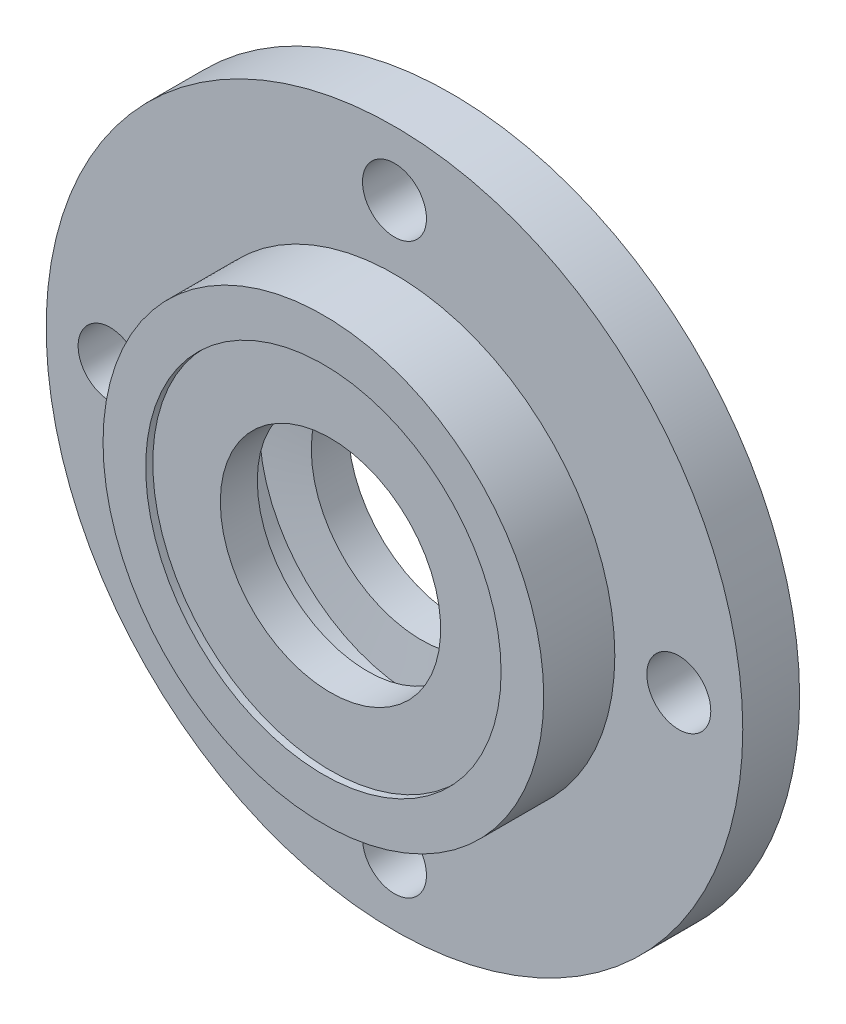
ISO-10303-21;
HEADER;
FILE_DESCRIPTION(('STEP AP214'),'2;1');
FILE_NAME('part.step','',(''),(''),'','','');
FILE_SCHEMA(('AUTOMOTIVE_DESIGN { 1 0 10303 214 1 1 1 1 }'));
ENDSEC;
DATA;
#1=APPLICATION_CONTEXT('core data for automotive mechanical design processes');
#2=APPLICATION_PROTOCOL_DEFINITION('international standard','automotive_design',2000,#1);
#3=PRODUCT_CONTEXT('',#1,'mechanical');
#4=PRODUCT('Part','Part','',(#3));
#5=PRODUCT_RELATED_PRODUCT_CATEGORY('part','',(#4));
#6=PRODUCT_DEFINITION_FORMATION('','',#4);
#7=PRODUCT_DEFINITION_CONTEXT('part definition',#1,'design');
#8=PRODUCT_DEFINITION('design','',#6,#7);
#9=PRODUCT_DEFINITION_SHAPE('','',#8);
#10=(LENGTH_UNIT() NAMED_UNIT(*) SI_UNIT(.MILLI.,.METRE.));
#11=(NAMED_UNIT(*) PLANE_ANGLE_UNIT() SI_UNIT($,.RADIAN.));
#12=(NAMED_UNIT(*) SI_UNIT($,.STERADIAN.) SOLID_ANGLE_UNIT());
#13=UNCERTAINTY_MEASURE_WITH_UNIT(LENGTH_MEASURE(1.E-05),#10,'distance_accuracy_value','');
#14=(GEOMETRIC_REPRESENTATION_CONTEXT(3) GLOBAL_UNCERTAINTY_ASSIGNED_CONTEXT((#13)) GLOBAL_UNIT_ASSIGNED_CONTEXT((#10,
#11,#12)) REPRESENTATION_CONTEXT('',''));
#15=CARTESIAN_POINT('',(0.,0.,0.));
#16=DIRECTION('',(0.,0.,1.));
#17=DIRECTION('',(1.,0.,0.));
#18=AXIS2_PLACEMENT_3D('',#15,#16,#17);
#19=CARTESIAN_POINT('',(0.,0.,9.));
#20=DIRECTION('',(0.,0.,1.));
#21=DIRECTION('',(1.,0.,0.));
#22=AXIS2_PLACEMENT_3D('',#19,#20,#21);
#23=PLANE('',#22);
#24=CARTESIAN_POINT('',(-40.,0.,9.));
#25=DIRECTION('',(0.,0.,1.));
#26=DIRECTION('',(1.,0.,0.));
#27=AXIS2_PLACEMENT_3D('',#24,#25,#26);
#28=CIRCLE('',#27,4.5);
#29=CARTESIAN_POINT('',(-35.5,0.,9.));
#30=VERTEX_POINT('',#29);
#31=EDGE_CURVE('E69',#30,#30,#28,.T.);
#32=ORIENTED_EDGE('',*,*,#31,.F.);
#33=EDGE_LOOP('',(#32));
#34=FACE_BOUND('',#33,.T.);
#35=CARTESIAN_POINT('',(0.,-40.,9.));
#36=DIRECTION('',(0.,0.,1.));
#37=DIRECTION('',(1.,0.,0.));
#38=AXIS2_PLACEMENT_3D('',#35,#36,#37);
#39=CIRCLE('',#38,4.5);
#40=CARTESIAN_POINT('',(4.5,-40.,9.));
#41=VERTEX_POINT('',#40);
#42=EDGE_CURVE('E59',#41,#41,#39,.T.);
#43=ORIENTED_EDGE('',*,*,#42,.F.);
#44=EDGE_LOOP('',(#43));
#45=FACE_BOUND('',#44,.T.);
#46=CARTESIAN_POINT('',(40.,0.,9.));
#47=DIRECTION('',(0.,0.,1.));
#48=DIRECTION('',(1.,0.,0.));
#49=AXIS2_PLACEMENT_3D('',#46,#47,#48);
#50=CIRCLE('',#49,4.5);
#51=CARTESIAN_POINT('',(44.5,0.,9.));
#52=VERTEX_POINT('',#51);
#53=EDGE_CURVE('E56',#52,#52,#50,.T.);
#54=ORIENTED_EDGE('',*,*,#53,.F.);
#55=EDGE_LOOP('',(#54));
#56=FACE_BOUND('',#55,.T.);
#57=CARTESIAN_POINT('',(0.,40.,9.));
#58=DIRECTION('',(0.,0.,1.));
#59=DIRECTION('',(1.,0.,0.));
#60=AXIS2_PLACEMENT_3D('',#57,#58,#59);
#61=CIRCLE('',#60,4.5);
#62=CARTESIAN_POINT('',(4.5,40.,9.));
#63=VERTEX_POINT('',#62);
#64=EDGE_CURVE('E53',#63,#63,#61,.T.);
#65=ORIENTED_EDGE('',*,*,#64,.F.);
#66=EDGE_LOOP('',(#65));
#67=FACE_BOUND('',#66,.T.);
#68=CARTESIAN_POINT('',(0.,0.,9.));
#69=DIRECTION('',(0.,0.,1.));
#70=DIRECTION('',(1.,0.,0.));
#71=AXIS2_PLACEMENT_3D('',#68,#69,#70);
#72=CIRCLE('',#71,49.);
#73=CARTESIAN_POINT('',(49.,0.,9.));
#74=VERTEX_POINT('',#73);
#75=EDGE_CURVE('E98',#74,#74,#72,.T.);
#76=ORIENTED_EDGE('',*,*,#75,.T.);
#77=EDGE_LOOP('',(#76));
#78=FACE_BOUND('',#77,.T.);
#79=CARTESIAN_POINT('',(0.,0.,9.));
#80=DIRECTION('',(0.,0.,1.));
#81=DIRECTION('',(1.,0.,0.));
#82=AXIS2_PLACEMENT_3D('',#79,#80,#81);
#83=CIRCLE('',#82,31.);
#84=CARTESIAN_POINT('',(31.,0.,9.));
#85=VERTEX_POINT('',#84);
#86=EDGE_CURVE('E89',#85,#85,#83,.T.);
#87=ORIENTED_EDGE('',*,*,#86,.F.);
#88=EDGE_LOOP('',(#87));
#89=FACE_BOUND('',#88,.T.);
#90=ADVANCED_FACE('F32',(#34,#45,#56,#67,#78,#89),#23,.T.);
#91=CARTESIAN_POINT('',(0.,0.,1.));
#92=DIRECTION('',(0.,0.,-1.));
#93=DIRECTION('',(-1.,0.,0.));
#94=AXIS2_PLACEMENT_3D('',#91,#92,#93);
#95=CYLINDRICAL_SURFACE('',#94,30.);
#96=CARTESIAN_POINT('',(0.,0.,1.));
#97=DIRECTION('',(0.,0.,1.));
#98=DIRECTION('',(1.,0.,0.));
#99=AXIS2_PLACEMENT_3D('',#96,#97,#98);
#100=CIRCLE('',#99,30.);
#101=CARTESIAN_POINT('',(30.,0.,1.));
#102=VERTEX_POINT('',#101);
#103=EDGE_CURVE('E45',#102,#102,#100,.T.);
#104=ORIENTED_EDGE('',*,*,#103,.F.);
#105=EDGE_LOOP('',(#104));
#106=FACE_BOUND('',#105,.T.);
#107=CARTESIAN_POINT('',(0.,0.,0.));
#108=DIRECTION('',(0.,0.,1.));
#109=DIRECTION('',(1.,0.,0.));
#110=AXIS2_PLACEMENT_3D('',#107,#108,#109);
#111=CIRCLE('',#110,30.);
#112=CARTESIAN_POINT('',(30.,0.,0.));
#113=VERTEX_POINT('',#112);
#114=EDGE_CURVE('E101',#113,#113,#111,.T.);
#115=ORIENTED_EDGE('',*,*,#114,.T.);
#116=EDGE_LOOP('',(#115));
#117=FACE_BOUND('',#116,.T.);
#118=ADVANCED_FACE('F108',(#106,#117),#95,.T.);
#119=CARTESIAN_POINT('',(0.,0.,0.));
#120=DIRECTION('',(0.,0.,1.));
#121=DIRECTION('',(1.,0.,0.));
#122=AXIS2_PLACEMENT_3D('',#119,#120,#121);
#123=PLANE('',#122);
#124=CARTESIAN_POINT('',(0.,0.,0.));
#125=DIRECTION('',(0.,0.,-1.));
#126=DIRECTION('',(-1.,0.,0.));
#127=AXIS2_PLACEMENT_3D('',#124,#125,#126);
#128=CIRCLE('',#127,15.5);
#129=CARTESIAN_POINT('',(-15.5,0.,0.));
#130=VERTEX_POINT('',#129);
#131=EDGE_CURVE('E80',#130,#130,#128,.T.);
#132=ORIENTED_EDGE('',*,*,#131,.F.);
#133=EDGE_LOOP('',(#132));
#134=FACE_BOUND('',#133,.T.);
#135=ORIENTED_EDGE('',*,*,#114,.F.);
#136=EDGE_LOOP('',(#135));
#137=FACE_BOUND('',#136,.T.);
#138=ADVANCED_FACE('F110',(#134,#137),#123,.F.);
#139=CARTESIAN_POINT('',(0.,0.,1.));
#140=DIRECTION('',(0.,0.,1.));
#141=DIRECTION('',(1.,0.,0.));
#142=AXIS2_PLACEMENT_3D('',#139,#140,#141);
#143=PLANE('',#142);
#144=CARTESIAN_POINT('',(-40.,0.,1.));
#145=DIRECTION('',(0.,0.,1.));
#146=DIRECTION('',(1.,0.,0.));
#147=AXIS2_PLACEMENT_3D('',#144,#145,#146);
#148=CIRCLE('',#147,4.5);
#149=CARTESIAN_POINT('',(-35.5,0.,1.));
#150=VERTEX_POINT('',#149);
#151=EDGE_CURVE('E36',#150,#150,#148,.T.);
#152=ORIENTED_EDGE('',*,*,#151,.T.);
#153=EDGE_LOOP('',(#152));
#154=FACE_BOUND('',#153,.T.);
#155=CARTESIAN_POINT('',(0.,-40.,1.));
#156=DIRECTION('',(0.,0.,1.));
#157=DIRECTION('',(1.,0.,0.));
#158=AXIS2_PLACEMENT_3D('',#155,#156,#157);
#159=CIRCLE('',#158,4.5);
#160=CARTESIAN_POINT('',(4.5,-40.,1.));
#161=VERTEX_POINT('',#160);
#162=EDGE_CURVE('E57',#161,#161,#159,.T.);
#163=ORIENTED_EDGE('',*,*,#162,.T.);
#164=EDGE_LOOP('',(#163));
#165=FACE_BOUND('',#164,.T.);
#166=CARTESIAN_POINT('',(40.,0.,1.));
#167=DIRECTION('',(0.,0.,1.));
#168=DIRECTION('',(1.,0.,0.));
#169=AXIS2_PLACEMENT_3D('',#166,#167,#168);
#170=CIRCLE('',#169,4.5);
#171=CARTESIAN_POINT('',(44.5,0.,1.));
#172=VERTEX_POINT('',#171);
#173=EDGE_CURVE('E54',#172,#172,#170,.T.);
#174=ORIENTED_EDGE('',*,*,#173,.T.);
#175=EDGE_LOOP('',(#174));
#176=FACE_BOUND('',#175,.T.);
#177=CARTESIAN_POINT('',(0.,40.,1.));
#178=DIRECTION('',(0.,0.,1.));
#179=DIRECTION('',(1.,0.,0.));
#180=AXIS2_PLACEMENT_3D('',#177,#178,#179);
#181=CIRCLE('',#180,4.5);
#182=CARTESIAN_POINT('',(4.5,40.,1.));
#183=VERTEX_POINT('',#182);
#184=EDGE_CURVE('E49',#183,#183,#181,.T.);
#185=ORIENTED_EDGE('',*,*,#184,.T.);
#186=EDGE_LOOP('',(#185));
#187=FACE_BOUND('',#186,.T.);
#188=CARTESIAN_POINT('',(0.,0.,1.));
#189=DIRECTION('',(0.,0.,1.));
#190=DIRECTION('',(1.,0.,0.));
#191=AXIS2_PLACEMENT_3D('',#188,#189,#190);
#192=CIRCLE('',#191,49.);
#193=CARTESIAN_POINT('',(49.,0.,1.));
#194=VERTEX_POINT('',#193);
#195=EDGE_CURVE('E95',#194,#194,#192,.T.);
#196=ORIENTED_EDGE('',*,*,#195,.F.);
#197=EDGE_LOOP('',(#196));
#198=FACE_BOUND('',#197,.T.);
#199=ORIENTED_EDGE('',*,*,#103,.T.);
#200=EDGE_LOOP('',(#199));
#201=FACE_BOUND('',#200,.T.);
#202=ADVANCED_FACE('F112',(#154,#165,#176,#187,#198,#201),#143,.F.);
#203=CARTESIAN_POINT('',(0.,0.,9.));
#204=DIRECTION('',(0.,0.,-1.));
#205=DIRECTION('',(-1.,0.,0.));
#206=AXIS2_PLACEMENT_3D('',#203,#204,#205);
#207=CYLINDRICAL_SURFACE('',#206,49.);
#208=ORIENTED_EDGE('',*,*,#75,.F.);
#209=EDGE_LOOP('',(#208));
#210=FACE_BOUND('',#209,.T.);
#211=ORIENTED_EDGE('',*,*,#195,.T.);
#212=EDGE_LOOP('',(#211));
#213=FACE_BOUND('',#212,.T.);
#214=ADVANCED_FACE('F120',(#210,#213),#207,.T.);
#215=CARTESIAN_POINT('',(0.,0.,19.));
#216=DIRECTION('',(0.,0.,-1.));
#217=DIRECTION('',(-1.,0.,0.));
#218=AXIS2_PLACEMENT_3D('',#215,#216,#217);
#219=CYLINDRICAL_SURFACE('',#218,31.);
#220=CARTESIAN_POINT('',(0.,0.,19.));
#221=DIRECTION('',(0.,0.,1.));
#222=DIRECTION('',(1.,0.,0.));
#223=AXIS2_PLACEMENT_3D('',#220,#221,#222);
#224=CIRCLE('',#223,31.);
#225=CARTESIAN_POINT('',(31.,0.,19.));
#226=VERTEX_POINT('',#225);
#227=EDGE_CURVE('E92',#226,#226,#224,.T.);
#228=ORIENTED_EDGE('',*,*,#227,.F.);
#229=EDGE_LOOP('',(#228));
#230=FACE_BOUND('',#229,.T.);
#231=ORIENTED_EDGE('',*,*,#86,.T.);
#232=EDGE_LOOP('',(#231));
#233=FACE_BOUND('',#232,.T.);
#234=ADVANCED_FACE('F136',(#230,#233),#219,.T.);
#235=CARTESIAN_POINT('',(0.,0.,19.));
#236=DIRECTION('',(0.,0.,1.));
#237=DIRECTION('',(1.,0.,0.));
#238=AXIS2_PLACEMENT_3D('',#235,#236,#237);
#239=PLANE('',#238);
#240=CARTESIAN_POINT('',(0.,0.,19.));
#241=DIRECTION('',(0.,0.,1.));
#242=DIRECTION('',(1.,0.,0.));
#243=AXIS2_PLACEMENT_3D('',#240,#241,#242);
#244=CIRCLE('',#243,25.);
#245=CARTESIAN_POINT('',(25.,0.,19.));
#246=VERTEX_POINT('',#245);
#247=EDGE_CURVE('E85',#246,#246,#244,.T.);
#248=ORIENTED_EDGE('',*,*,#247,.F.);
#249=EDGE_LOOP('',(#248));
#250=FACE_BOUND('',#249,.T.);
#251=ORIENTED_EDGE('',*,*,#227,.T.);
#252=EDGE_LOOP('',(#251));
#253=FACE_BOUND('',#252,.T.);
#254=ADVANCED_FACE('F143',(#250,#253),#239,.T.);
#255=CARTESIAN_POINT('',(0.,0.,18.));
#256=DIRECTION('',(0.,0.,1.));
#257=DIRECTION('',(1.,0.,0.));
#258=AXIS2_PLACEMENT_3D('',#255,#256,#257);
#259=CYLINDRICAL_SURFACE('',#258,25.);
#260=CARTESIAN_POINT('',(0.,0.,18.));
#261=DIRECTION('',(0.,0.,1.));
#262=DIRECTION('',(1.,0.,0.));
#263=AXIS2_PLACEMENT_3D('',#260,#261,#262);
#264=CIRCLE('',#263,25.);
#265=CARTESIAN_POINT('',(25.,0.,18.));
#266=VERTEX_POINT('',#265);
#267=EDGE_CURVE('E86',#266,#266,#264,.T.);
#268=ORIENTED_EDGE('',*,*,#267,.F.);
#269=EDGE_LOOP('',(#268));
#270=FACE_BOUND('',#269,.T.);
#271=ORIENTED_EDGE('',*,*,#247,.T.);
#272=EDGE_LOOP('',(#271));
#273=FACE_BOUND('',#272,.T.);
#274=ADVANCED_FACE('F158',(#270,#273),#259,.F.);
#275=CARTESIAN_POINT('',(0.,0.,18.));
#276=DIRECTION('',(0.,0.,1.));
#277=DIRECTION('',(1.,0.,0.));
#278=AXIS2_PLACEMENT_3D('',#275,#276,#277);
#279=PLANE('',#278);
#280=CARTESIAN_POINT('',(0.,0.,18.));
#281=DIRECTION('',(0.,0.,-1.));
#282=DIRECTION('',(-1.,0.,0.));
#283=AXIS2_PLACEMENT_3D('',#280,#281,#282);
#284=CIRCLE('',#283,15.5);
#285=CARTESIAN_POINT('',(-15.5,0.,18.));
#286=VERTEX_POINT('',#285);
#287=EDGE_CURVE('E52',#286,#286,#284,.T.);
#288=ORIENTED_EDGE('',*,*,#287,.T.);
#289=EDGE_LOOP('',(#288));
#290=FACE_BOUND('',#289,.T.);
#291=ORIENTED_EDGE('',*,*,#267,.T.);
#292=EDGE_LOOP('',(#291));
#293=FACE_BOUND('',#292,.T.);
#294=ADVANCED_FACE('F165',(#290,#293),#279,.T.);
#295=CARTESIAN_POINT('',(0.,0.,6.));
#296=DIRECTION('',(0.,0.,-1.));
#297=DIRECTION('',(-1.,0.,0.));
#298=AXIS2_PLACEMENT_3D('',#295,#296,#297);
#299=CYLINDRICAL_SURFACE('',#298,15.5);
#300=CARTESIAN_POINT('',(0.,0.,5.20190035413113));
#301=DIRECTION('',(0.,0.,-1.));
#302=DIRECTION('',(-1.,0.,0.));
#303=AXIS2_PLACEMENT_3D('',#300,#301,#302);
#304=CIRCLE('',#303,15.5);
#305=CARTESIAN_POINT('',(-15.5,0.,5.20190035413113));
#306=VERTEX_POINT('',#305);
#307=EDGE_CURVE('E40',#306,#306,#304,.F.);
#308=ORIENTED_EDGE('',*,*,#307,.T.);
#309=EDGE_LOOP('',(#308));
#310=FACE_BOUND('',#309,.T.);
#311=ORIENTED_EDGE('',*,*,#131,.T.);
#312=EDGE_LOOP('',(#311));
#313=FACE_BOUND('',#312,.T.);
#314=ADVANCED_FACE('F172',(#310,#313),#299,.F.);
#315=CARTESIAN_POINT('',(0.,0.,12.));
#316=DIRECTION('',(0.,0.,-1.));
#317=DIRECTION('',(-1.,0.,0.));
#318=AXIS2_PLACEMENT_3D('',#315,#316,#317);
#319=CYLINDRICAL_SURFACE('',#318,22.);
#320=CARTESIAN_POINT('',(0.,0.,12.));
#321=DIRECTION('',(0.,0.,-1.));
#322=DIRECTION('',(-1.,0.,0.));
#323=AXIS2_PLACEMENT_3D('',#320,#321,#322);
#324=CIRCLE('',#323,22.);
#325=CARTESIAN_POINT('',(-22.,0.,12.));
#326=VERTEX_POINT('',#325);
#327=EDGE_CURVE('E77',#326,#326,#324,.T.);
#328=ORIENTED_EDGE('',*,*,#327,.F.);
#329=EDGE_LOOP('',(#328));
#330=FACE_BOUND('',#329,.T.);
#331=CARTESIAN_POINT('',(0.,0.,6.));
#332=DIRECTION('',(0.,0.,-1.));
#333=DIRECTION('',(-1.,0.,0.));
#334=AXIS2_PLACEMENT_3D('',#331,#332,#333);
#335=CIRCLE('',#334,22.);
#336=CARTESIAN_POINT('',(-22.,0.,6.));
#337=VERTEX_POINT('',#336);
#338=EDGE_CURVE('E76',#337,#337,#335,.T.);
#339=ORIENTED_EDGE('',*,*,#338,.T.);
#340=EDGE_LOOP('',(#339));
#341=FACE_BOUND('',#340,.T.);
#342=ADVANCED_FACE('F176',(#330,#341),#319,.F.);
#343=CARTESIAN_POINT('',(0.,0.,18.));
#344=DIRECTION('',(0.,0.,-1.));
#345=DIRECTION('',(-1.,0.,0.));
#346=AXIS2_PLACEMENT_3D('',#343,#344,#345);
#347=CYLINDRICAL_SURFACE('',#346,15.5);
#348=CARTESIAN_POINT('',(0.,0.,12.7980996458689));
#349=DIRECTION('',(0.,0.,-1.));
#350=DIRECTION('',(-1.,0.,0.));
#351=AXIS2_PLACEMENT_3D('',#348,#349,#350);
#352=CIRCLE('',#351,15.5);
#353=CARTESIAN_POINT('',(-15.5,0.,12.7980996458689));
#354=VERTEX_POINT('',#353);
#355=EDGE_CURVE('E10',#354,#354,#352,.T.);
#356=ORIENTED_EDGE('',*,*,#355,.T.);
#357=EDGE_LOOP('',(#356));
#358=FACE_BOUND('',#357,.T.);
#359=ORIENTED_EDGE('',*,*,#287,.F.);
#360=EDGE_LOOP('',(#359));
#361=FACE_BOUND('',#360,.T.);
#362=ADVANCED_FACE('F180',(#358,#361),#347,.F.);
#363=CARTESIAN_POINT('',(0.,0.,5.20190035413113));
#364=DIRECTION('',(0.,0.,1.));
#365=DIRECTION('',(1.,0.,0.));
#366=AXIS2_PLACEMENT_3D('',#363,#364,#365);
#367=CONICAL_SURFACE('',#366,15.5,1.4486232791553);
#368=ORIENTED_EDGE('',*,*,#338,.F.);
#369=EDGE_LOOP('',(#368));
#370=FACE_BOUND('',#369,.T.);
#371=ORIENTED_EDGE('',*,*,#307,.F.);
#372=EDGE_LOOP('',(#371));
#373=FACE_BOUND('',#372,.T.);
#374=ADVANCED_FACE('F184',(#370,#373),#367,.F.);
#375=CARTESIAN_POINT('',(0.,0.,12.7980996458689));
#376=DIRECTION('',(0.,0.,-1.));
#377=DIRECTION('',(-1.,0.,0.));
#378=AXIS2_PLACEMENT_3D('',#375,#376,#377);
#379=CONICAL_SURFACE('',#378,15.5,1.4486232791553);
#380=ORIENTED_EDGE('',*,*,#327,.T.);
#381=EDGE_LOOP('',(#380));
#382=FACE_BOUND('',#381,.T.);
#383=ORIENTED_EDGE('',*,*,#355,.F.);
#384=EDGE_LOOP('',(#383));
#385=FACE_BOUND('',#384,.T.);
#386=ADVANCED_FACE('F34',(#382,#385),#379,.F.);
#387=CARTESIAN_POINT('',(0.,40.,-0.999999999999999));
#388=DIRECTION('',(0.,0.,1.));
#389=DIRECTION('',(1.,0.,0.));
#390=AXIS2_PLACEMENT_3D('',#387,#388,#389);
#391=CYLINDRICAL_SURFACE('',#390,4.5);
#392=ORIENTED_EDGE('',*,*,#64,.T.);
#393=EDGE_LOOP('',(#392));
#394=FACE_BOUND('',#393,.T.);
#395=ORIENTED_EDGE('',*,*,#184,.F.);
#396=EDGE_LOOP('',(#395));
#397=FACE_BOUND('',#396,.T.);
#398=ADVANCED_FACE('F185',(#394,#397),#391,.F.);
#399=CARTESIAN_POINT('',(40.,0.,-0.999999999999999));
#400=DIRECTION('',(0.,0.,1.));
#401=DIRECTION('',(1.,0.,0.));
#402=AXIS2_PLACEMENT_3D('',#399,#400,#401);
#403=CYLINDRICAL_SURFACE('',#402,4.5);
#404=ORIENTED_EDGE('',*,*,#53,.T.);
#405=EDGE_LOOP('',(#404));
#406=FACE_BOUND('',#405,.T.);
#407=ORIENTED_EDGE('',*,*,#173,.F.);
#408=EDGE_LOOP('',(#407));
#409=FACE_BOUND('',#408,.T.);
#410=ADVANCED_FACE('F188',(#406,#409),#403,.F.);
#411=CARTESIAN_POINT('',(0.,-40.,-0.999999999999999));
#412=DIRECTION('',(0.,0.,1.));
#413=DIRECTION('',(1.,0.,0.));
#414=AXIS2_PLACEMENT_3D('',#411,#412,#413);
#415=CYLINDRICAL_SURFACE('',#414,4.5);
#416=ORIENTED_EDGE('',*,*,#42,.T.);
#417=EDGE_LOOP('',(#416));
#418=FACE_BOUND('',#417,.T.);
#419=ORIENTED_EDGE('',*,*,#162,.F.);
#420=EDGE_LOOP('',(#419));
#421=FACE_BOUND('',#420,.T.);
#422=ADVANCED_FACE('F192',(#418,#421),#415,.F.);
#423=CARTESIAN_POINT('',(-40.,0.,-0.999999999999999));
#424=DIRECTION('',(0.,0.,1.));
#425=DIRECTION('',(1.,0.,0.));
#426=AXIS2_PLACEMENT_3D('',#423,#424,#425);
#427=CYLINDRICAL_SURFACE('',#426,4.5);
#428=ORIENTED_EDGE('',*,*,#31,.T.);
#429=EDGE_LOOP('',(#428));
#430=FACE_BOUND('',#429,.T.);
#431=ORIENTED_EDGE('',*,*,#151,.F.);
#432=EDGE_LOOP('',(#431));
#433=FACE_BOUND('',#432,.T.);
#434=ADVANCED_FACE('F196',(#430,#433),#427,.F.);
#435=CLOSED_SHELL('',(#90,#118,#138,#202,#214,#234,#254,#274,#294,#314,#342,#362,#374,#386,#398,
#410,#422,#434));
#436=MANIFOLD_SOLID_BREP('B2',#435);
#437=ADVANCED_BREP_SHAPE_REPRESENTATION('',(#18,#436),#14);
#438=SHAPE_DEFINITION_REPRESENTATION(#9,#437);
ENDSEC;
END-ISO-10303-21;
